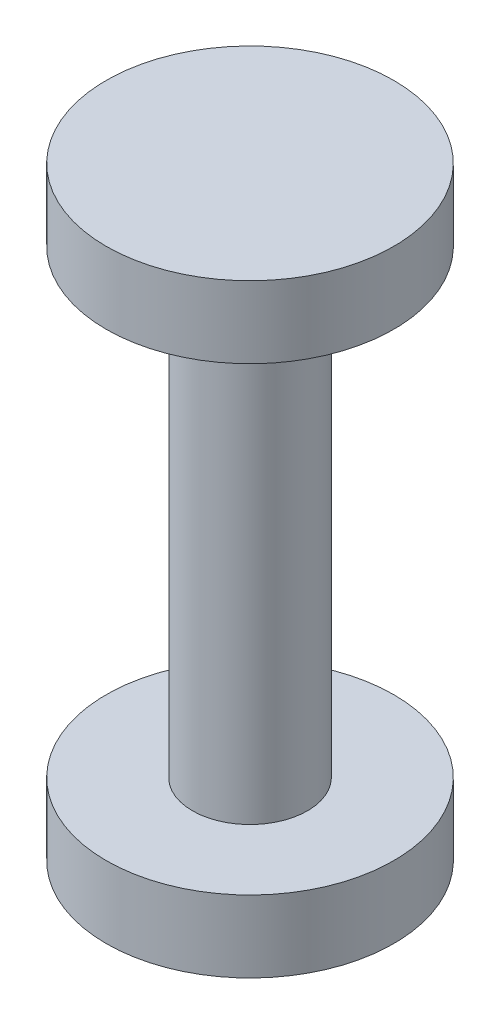
ISO-10303-21;
HEADER;
FILE_DESCRIPTION(('STEP AP214'),'2;1');
FILE_NAME('part.step','',(''),(''),'','','');
FILE_SCHEMA(('AUTOMOTIVE_DESIGN { 1 0 10303 214 1 1 1 1 }'));
ENDSEC;
DATA;
#1=APPLICATION_CONTEXT('core data for automotive mechanical design processes');
#2=APPLICATION_PROTOCOL_DEFINITION('international standard','automotive_design',2000,#1);
#3=PRODUCT_CONTEXT('',#1,'mechanical');
#4=PRODUCT('Part','Part','',(#3));
#5=PRODUCT_RELATED_PRODUCT_CATEGORY('part','',(#4));
#6=PRODUCT_DEFINITION_FORMATION('','',#4);
#7=PRODUCT_DEFINITION_CONTEXT('part definition',#1,'design');
#8=PRODUCT_DEFINITION('design','',#6,#7);
#9=PRODUCT_DEFINITION_SHAPE('','',#8);
#10=(LENGTH_UNIT() NAMED_UNIT(*) SI_UNIT(.MILLI.,.METRE.));
#11=(NAMED_UNIT(*) PLANE_ANGLE_UNIT() SI_UNIT($,.RADIAN.));
#12=(NAMED_UNIT(*) SI_UNIT($,.STERADIAN.) SOLID_ANGLE_UNIT());
#13=UNCERTAINTY_MEASURE_WITH_UNIT(LENGTH_MEASURE(1.E-05),#10,'distance_accuracy_value','');
#14=(GEOMETRIC_REPRESENTATION_CONTEXT(3) GLOBAL_UNCERTAINTY_ASSIGNED_CONTEXT((#13)) GLOBAL_UNIT_ASSIGNED_CONTEXT((#10,
#11,#12)) REPRESENTATION_CONTEXT('',''));
#15=CARTESIAN_POINT('',(0.,0.,0.));
#16=DIRECTION('',(0.,0.,1.));
#17=DIRECTION('',(1.,0.,0.));
#18=AXIS2_PLACEMENT_3D('',#15,#16,#17);
#19=CARTESIAN_POINT('',(0.,0.,0.));
#20=DIRECTION('',(0.,1.,0.));
#21=DIRECTION('',(0.,0.,1.));
#22=AXIS2_PLACEMENT_3D('',#19,#20,#21);
#23=PLANE('',#22);
#24=CARTESIAN_POINT('',(0.,0.,0.));
#25=DIRECTION('',(0.,1.,0.));
#26=DIRECTION('',(0.,0.,1.));
#27=AXIS2_PLACEMENT_3D('',#24,#25,#26);
#28=CIRCLE('',#27,2.54);
#29=CARTESIAN_POINT('',(0.,0.,2.54));
#30=VERTEX_POINT('',#29);
#31=EDGE_CURVE('E10',#30,#30,#28,.T.);
#32=ORIENTED_EDGE('',*,*,#31,.F.);
#33=EDGE_LOOP('',(#32));
#34=FACE_BOUND('',#33,.T.);
#35=ADVANCED_FACE('F31',(#34),#23,.F.);
#36=CARTESIAN_POINT('',(0.,10.668,0.));
#37=DIRECTION('',(0.,1.,0.));
#38=DIRECTION('',(0.,0.,1.));
#39=AXIS2_PLACEMENT_3D('',#36,#37,#38);
#40=CYLINDRICAL_SURFACE('',#39,2.54);
#41=CARTESIAN_POINT('',(0.,1.27,0.));
#42=DIRECTION('',(0.,1.,0.));
#43=DIRECTION('',(0.,0.,1.));
#44=AXIS2_PLACEMENT_3D('',#41,#42,#43);
#45=CIRCLE('',#44,2.54);
#46=CARTESIAN_POINT('',(0.,1.27,2.54));
#47=VERTEX_POINT('',#46);
#48=EDGE_CURVE('E37',#47,#47,#45,.T.);
#49=ORIENTED_EDGE('',*,*,#48,.F.);
#50=EDGE_LOOP('',(#49));
#51=FACE_BOUND('',#50,.T.);
#52=ORIENTED_EDGE('',*,*,#31,.T.);
#53=EDGE_LOOP('',(#52));
#54=FACE_BOUND('',#53,.T.);
#55=ADVANCED_FACE('F79',(#51,#54),#40,.T.);
#56=CARTESIAN_POINT('',(2.54,1.27,0.));
#57=DIRECTION('',(0.,-1.,0.));
#58=DIRECTION('',(0.,0.,-1.));
#59=AXIS2_PLACEMENT_3D('',#56,#57,#58);
#60=PLANE('',#59);
#61=CARTESIAN_POINT('',(0.,1.26999999999999,0.));
#62=DIRECTION('',(0.,1.,0.));
#63=DIRECTION('',(0.,0.,1.));
#64=AXIS2_PLACEMENT_3D('',#61,#62,#63);
#65=CIRCLE('',#64,1.016);
#66=CARTESIAN_POINT('',(0.,1.26999999999999,1.016));
#67=VERTEX_POINT('',#66);
#68=EDGE_CURVE('E41',#67,#67,#65,.T.);
#69=ORIENTED_EDGE('',*,*,#68,.F.);
#70=EDGE_LOOP('',(#69));
#71=FACE_BOUND('',#70,.T.);
#72=ORIENTED_EDGE('',*,*,#48,.T.);
#73=EDGE_LOOP('',(#72));
#74=FACE_BOUND('',#73,.T.);
#75=ADVANCED_FACE('F74',(#71,#74),#60,.F.);
#76=CARTESIAN_POINT('',(0.,10.668,0.));
#77=DIRECTION('',(0.,1.,0.));
#78=DIRECTION('',(0.,0.,1.));
#79=AXIS2_PLACEMENT_3D('',#76,#77,#78);
#80=CYLINDRICAL_SURFACE('',#79,1.016);
#81=CARTESIAN_POINT('',(0.,9.39799999999999,0.));
#82=DIRECTION('',(0.,1.,0.));
#83=DIRECTION('',(0.,0.,1.));
#84=AXIS2_PLACEMENT_3D('',#81,#82,#83);
#85=CIRCLE('',#84,1.016);
#86=CARTESIAN_POINT('',(0.,9.39799999999999,1.016));
#87=VERTEX_POINT('',#86);
#88=EDGE_CURVE('E45',#87,#87,#85,.T.);
#89=ORIENTED_EDGE('',*,*,#88,.F.);
#90=EDGE_LOOP('',(#89));
#91=FACE_BOUND('',#90,.T.);
#92=ORIENTED_EDGE('',*,*,#68,.T.);
#93=EDGE_LOOP('',(#92));
#94=FACE_BOUND('',#93,.T.);
#95=ADVANCED_FACE('F68',(#91,#94),#80,.T.);
#96=CARTESIAN_POINT('',(2.54,9.39799999999999,0.));
#97=DIRECTION('',(0.,1.,0.));
#98=DIRECTION('',(0.,0.,1.));
#99=AXIS2_PLACEMENT_3D('',#96,#97,#98);
#100=PLANE('',#99);
#101=CARTESIAN_POINT('',(0.,9.39799999999998,0.));
#102=DIRECTION('',(0.,1.,0.));
#103=DIRECTION('',(0.,0.,1.));
#104=AXIS2_PLACEMENT_3D('',#101,#102,#103);
#105=CIRCLE('',#104,2.54);
#106=CARTESIAN_POINT('',(0.,9.39799999999998,2.54));
#107=VERTEX_POINT('',#106);
#108=EDGE_CURVE('E50',#107,#107,#105,.T.);
#109=ORIENTED_EDGE('',*,*,#108,.F.);
#110=EDGE_LOOP('',(#109));
#111=FACE_BOUND('',#110,.T.);
#112=ORIENTED_EDGE('',*,*,#88,.T.);
#113=EDGE_LOOP('',(#112));
#114=FACE_BOUND('',#113,.T.);
#115=ADVANCED_FACE('F62',(#111,#114),#100,.F.);
#116=CARTESIAN_POINT('',(0.,10.668,0.));
#117=DIRECTION('',(0.,1.,0.));
#118=DIRECTION('',(0.,0.,1.));
#119=AXIS2_PLACEMENT_3D('',#116,#117,#118);
#120=CYLINDRICAL_SURFACE('',#119,2.54);
#121=CARTESIAN_POINT('',(0.,10.668,0.));
#122=DIRECTION('',(0.,1.,0.));
#123=DIRECTION('',(0.,0.,1.));
#124=AXIS2_PLACEMENT_3D('',#121,#122,#123);
#125=CIRCLE('',#124,2.54);
#126=CARTESIAN_POINT('',(0.,10.668,2.54));
#127=VERTEX_POINT('',#126);
#128=EDGE_CURVE('E53',#127,#127,#125,.T.);
#129=ORIENTED_EDGE('',*,*,#128,.F.);
#130=EDGE_LOOP('',(#129));
#131=FACE_BOUND('',#130,.T.);
#132=ORIENTED_EDGE('',*,*,#108,.T.);
#133=EDGE_LOOP('',(#132));
#134=FACE_BOUND('',#133,.T.);
#135=ADVANCED_FACE('F59',(#131,#134),#120,.T.);
#136=CARTESIAN_POINT('',(0.,10.668,0.));
#137=DIRECTION('',(0.,-1.,0.));
#138=DIRECTION('',(0.,0.,-1.));
#139=AXIS2_PLACEMENT_3D('',#136,#137,#138);
#140=PLANE('',#139);
#141=ORIENTED_EDGE('',*,*,#128,.T.);
#142=EDGE_LOOP('',(#141));
#143=FACE_BOUND('',#142,.T.);
#144=ADVANCED_FACE('F57',(#143),#140,.F.);
#145=CLOSED_SHELL('',(#35,#55,#75,#95,#115,#135,#144));
#146=MANIFOLD_SOLID_BREP('B2',#145);
#147=ADVANCED_BREP_SHAPE_REPRESENTATION('',(#18,#146),#14);
#148=SHAPE_DEFINITION_REPRESENTATION(#9,#147);
ENDSEC;
END-ISO-10303-21;
